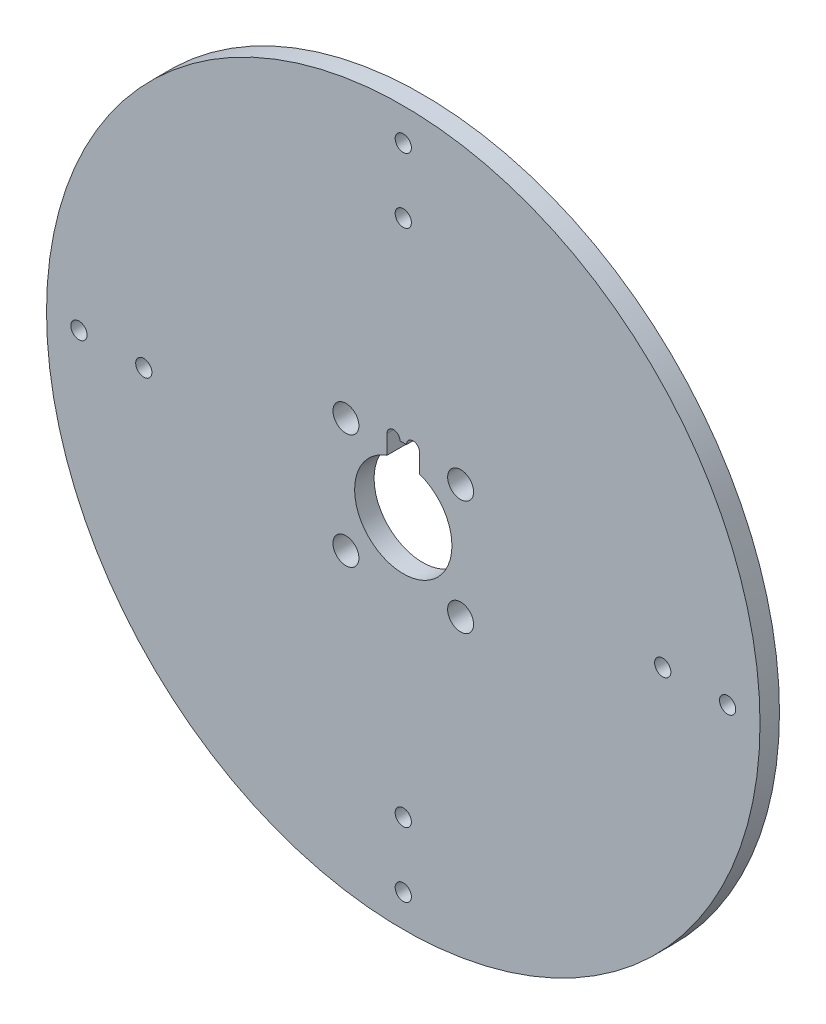
ISO-10303-21;
HEADER;
FILE_DESCRIPTION(('STEP AP214'),'2;1');
FILE_NAME('part.step','',(''),(''),'','','');
FILE_SCHEMA(('AUTOMOTIVE_DESIGN { 1 0 10303 214 1 1 1 1 }'));
ENDSEC;
DATA;
#1=APPLICATION_CONTEXT('core data for automotive mechanical design processes');
#2=APPLICATION_PROTOCOL_DEFINITION('international standard','automotive_design',2000,#1);
#3=PRODUCT_CONTEXT('',#1,'mechanical');
#4=PRODUCT('Part','Part','',(#3));
#5=PRODUCT_RELATED_PRODUCT_CATEGORY('part','',(#4));
#6=PRODUCT_DEFINITION_FORMATION('','',#4);
#7=PRODUCT_DEFINITION_CONTEXT('part definition',#1,'design');
#8=PRODUCT_DEFINITION('design','',#6,#7);
#9=PRODUCT_DEFINITION_SHAPE('','',#8);
#10=(LENGTH_UNIT() NAMED_UNIT(*) SI_UNIT(.MILLI.,.METRE.));
#11=(NAMED_UNIT(*) PLANE_ANGLE_UNIT() SI_UNIT($,.RADIAN.));
#12=(NAMED_UNIT(*) SI_UNIT($,.STERADIAN.) SOLID_ANGLE_UNIT());
#13=UNCERTAINTY_MEASURE_WITH_UNIT(LENGTH_MEASURE(1.E-05),#10,'distance_accuracy_value','');
#14=(GEOMETRIC_REPRESENTATION_CONTEXT(3) GLOBAL_UNCERTAINTY_ASSIGNED_CONTEXT((#13)) GLOBAL_UNIT_ASSIGNED_CONTEXT((#10,
#11,#12)) REPRESENTATION_CONTEXT('',''));
#15=CARTESIAN_POINT('',(0.,0.,0.));
#16=DIRECTION('',(0.,0.,1.));
#17=DIRECTION('',(1.,0.,0.));
#18=AXIS2_PLACEMENT_3D('',#15,#16,#17);
#19=CARTESIAN_POINT('',(0.,0.,1.5));
#20=DIRECTION('',(0.,0.,1.));
#21=DIRECTION('',(1.,0.,0.));
#22=AXIS2_PLACEMENT_3D('',#19,#20,#21);
#23=PLANE('',#22);
#24=CARTESIAN_POINT('',(-8.83883476483186,-8.83883476483183,1.5));
#25=DIRECTION('',(0.,0.,1.));
#26=DIRECTION('',(1.,0.,0.));
#27=AXIS2_PLACEMENT_3D('',#24,#25,#26);
#28=CIRCLE('',#27,1.99999999999999);
#29=CARTESIAN_POINT('',(-6.83883476483187,-8.83883476483183,1.5));
#30=VERTEX_POINT('',#29);
#31=EDGE_CURVE('E218',#30,#30,#28,.T.);
#32=ORIENTED_EDGE('',*,*,#31,.F.);
#33=EDGE_LOOP('',(#32));
#34=FACE_BOUND('',#33,.T.);
#35=CARTESIAN_POINT('',(-8.83883476483183,8.83883476483186,1.5));
#36=DIRECTION('',(0.,0.,1.));
#37=DIRECTION('',(1.,0.,0.));
#38=AXIS2_PLACEMENT_3D('',#35,#36,#37);
#39=CIRCLE('',#38,1.99999999999999);
#40=CARTESIAN_POINT('',(-6.83883476483184,8.83883476483186,1.5));
#41=VERTEX_POINT('',#40);
#42=EDGE_CURVE('E212',#41,#41,#39,.T.);
#43=ORIENTED_EDGE('',*,*,#42,.F.);
#44=EDGE_LOOP('',(#43));
#45=FACE_BOUND('',#44,.T.);
#46=CARTESIAN_POINT('',(8.83883476483186,8.83883476483183,1.5));
#47=DIRECTION('',(0.,0.,1.));
#48=DIRECTION('',(1.,0.,0.));
#49=AXIS2_PLACEMENT_3D('',#46,#47,#48);
#50=CIRCLE('',#49,1.99999999999999);
#51=CARTESIAN_POINT('',(10.8388347648318,8.83883476483183,1.5));
#52=VERTEX_POINT('',#51);
#53=EDGE_CURVE('E209',#52,#52,#50,.T.);
#54=ORIENTED_EDGE('',*,*,#53,.F.);
#55=EDGE_LOOP('',(#54));
#56=FACE_BOUND('',#55,.T.);
#57=CARTESIAN_POINT('',(8.83883476483183,-8.83883476483186,1.5));
#58=DIRECTION('',(0.,0.,1.));
#59=DIRECTION('',(1.,0.,0.));
#60=AXIS2_PLACEMENT_3D('',#57,#58,#59);
#61=CIRCLE('',#60,1.99999999999999);
#62=CARTESIAN_POINT('',(10.8388347648318,-8.83883476483186,1.5));
#63=VERTEX_POINT('',#62);
#64=EDGE_CURVE('E203',#63,#63,#61,.T.);
#65=ORIENTED_EDGE('',*,*,#64,.F.);
#66=EDGE_LOOP('',(#65));
#67=FACE_BOUND('',#66,.T.);
#68=CARTESIAN_POINT('',(0.,50.,1.5));
#69=DIRECTION('',(0.,0.,1.));
#70=DIRECTION('',(1.,0.,0.));
#71=AXIS2_PLACEMENT_3D('',#68,#69,#70);
#72=CIRCLE('',#71,1.25);
#73=CARTESIAN_POINT('',(1.25,50.,1.5));
#74=VERTEX_POINT('',#73);
#75=EDGE_CURVE('E197',#74,#74,#72,.T.);
#76=ORIENTED_EDGE('',*,*,#75,.F.);
#77=EDGE_LOOP('',(#76));
#78=FACE_BOUND('',#77,.T.);
#79=CARTESIAN_POINT('',(0.,40.,1.5));
#80=DIRECTION('',(0.,0.,1.));
#81=DIRECTION('',(1.,0.,0.));
#82=AXIS2_PLACEMENT_3D('',#79,#80,#81);
#83=CIRCLE('',#82,1.25);
#84=CARTESIAN_POINT('',(1.25,40.,1.5));
#85=VERTEX_POINT('',#84);
#86=EDGE_CURVE('E191',#85,#85,#83,.T.);
#87=ORIENTED_EDGE('',*,*,#86,.F.);
#88=EDGE_LOOP('',(#87));
#89=FACE_BOUND('',#88,.T.);
#90=CARTESIAN_POINT('',(-50.,0.,1.5));
#91=DIRECTION('',(0.,0.,1.));
#92=DIRECTION('',(1.,0.,0.));
#93=AXIS2_PLACEMENT_3D('',#90,#91,#92);
#94=CIRCLE('',#93,1.25);
#95=CARTESIAN_POINT('',(-48.75,0.,1.5));
#96=VERTEX_POINT('',#95);
#97=EDGE_CURVE('E185',#96,#96,#94,.T.);
#98=ORIENTED_EDGE('',*,*,#97,.F.);
#99=EDGE_LOOP('',(#98));
#100=FACE_BOUND('',#99,.T.);
#101=CARTESIAN_POINT('',(-40.,0.,1.5));
#102=DIRECTION('',(0.,0.,1.));
#103=DIRECTION('',(1.,0.,0.));
#104=AXIS2_PLACEMENT_3D('',#101,#102,#103);
#105=CIRCLE('',#104,1.25);
#106=CARTESIAN_POINT('',(-38.75,0.,1.5));
#107=VERTEX_POINT('',#106);
#108=EDGE_CURVE('E179',#107,#107,#105,.T.);
#109=ORIENTED_EDGE('',*,*,#108,.F.);
#110=EDGE_LOOP('',(#109));
#111=FACE_BOUND('',#110,.T.);
#112=CARTESIAN_POINT('',(0.,-50.,1.5));
#113=DIRECTION('',(0.,0.,1.));
#114=DIRECTION('',(1.,0.,0.));
#115=AXIS2_PLACEMENT_3D('',#112,#113,#114);
#116=CIRCLE('',#115,1.25);
#117=CARTESIAN_POINT('',(1.25000000000001,-50.,1.5));
#118=VERTEX_POINT('',#117);
#119=EDGE_CURVE('E173',#118,#118,#116,.T.);
#120=ORIENTED_EDGE('',*,*,#119,.F.);
#121=EDGE_LOOP('',(#120));
#122=FACE_BOUND('',#121,.T.);
#123=CARTESIAN_POINT('',(0.,-40.,1.5));
#124=DIRECTION('',(0.,0.,1.));
#125=DIRECTION('',(1.,0.,0.));
#126=AXIS2_PLACEMENT_3D('',#123,#124,#125);
#127=CIRCLE('',#126,1.25);
#128=CARTESIAN_POINT('',(1.25,-40.,1.5));
#129=VERTEX_POINT('',#128);
#130=EDGE_CURVE('E167',#129,#129,#127,.T.);
#131=ORIENTED_EDGE('',*,*,#130,.F.);
#132=EDGE_LOOP('',(#131));
#133=FACE_BOUND('',#132,.T.);
#134=CARTESIAN_POINT('',(50.,0.,1.5));
#135=DIRECTION('',(0.,0.,1.));
#136=DIRECTION('',(1.,0.,0.));
#137=AXIS2_PLACEMENT_3D('',#134,#135,#136);
#138=CIRCLE('',#137,1.25);
#139=CARTESIAN_POINT('',(51.25,0.,1.5));
#140=VERTEX_POINT('',#139);
#141=EDGE_CURVE('E161',#140,#140,#138,.T.);
#142=ORIENTED_EDGE('',*,*,#141,.F.);
#143=EDGE_LOOP('',(#142));
#144=FACE_BOUND('',#143,.T.);
#145=CARTESIAN_POINT('',(40.,0.,1.5));
#146=DIRECTION('',(0.,0.,1.));
#147=DIRECTION('',(1.,0.,0.));
#148=AXIS2_PLACEMENT_3D('',#145,#146,#147);
#149=CIRCLE('',#148,1.25);
#150=CARTESIAN_POINT('',(41.25,0.,1.5));
#151=VERTEX_POINT('',#150);
#152=EDGE_CURVE('E153',#151,#151,#149,.T.);
#153=ORIENTED_EDGE('',*,*,#152,.F.);
#154=EDGE_LOOP('',(#153));
#155=FACE_BOUND('',#154,.T.);
#156=CARTESIAN_POINT('',(0.,0.,1.5));
#157=DIRECTION('',(0.,0.,1.));
#158=DIRECTION('',(1.,0.,0.));
#159=AXIS2_PLACEMENT_3D('',#156,#157,#158);
#160=CIRCLE('',#159,55.);
#161=CARTESIAN_POINT('',(55.,0.,1.5));
#162=VERTEX_POINT('',#161);
#163=EDGE_CURVE('E11',#162,#162,#160,.T.);
#164=ORIENTED_EDGE('',*,*,#163,.T.);
#165=EDGE_LOOP('',(#164));
#166=FACE_BOUND('',#165,.T.);
#167=DIRECTION('',(0.,1.,0.));
#168=VECTOR('',#167,1.);
#169=CARTESIAN_POINT('',(-2.5,0.,1.5));
#170=LINE('',#169,#168);
#171=CARTESIAN_POINT('',(-2.5,7.07106781186548,1.5));
#172=VERTEX_POINT('',#171);
#173=CARTESIAN_POINT('',(-2.5,10.,1.5));
#174=VERTEX_POINT('',#173);
#175=EDGE_CURVE('E99',#172,#174,#170,.T.);
#176=ORIENTED_EDGE('',*,*,#175,.T.);
#177=CARTESIAN_POINT('',(-1.5,10.,1.5));
#178=DIRECTION('',(0.,0.,1.));
#179=DIRECTION('',(1.,0.,0.));
#180=AXIS2_PLACEMENT_3D('',#177,#178,#179);
#181=CIRCLE('',#180,1.);
#182=CARTESIAN_POINT('',(-0.499999999999999,10.,1.5));
#183=VERTEX_POINT('',#182);
#184=EDGE_CURVE('E49',#174,#183,#181,.F.);
#185=ORIENTED_EDGE('',*,*,#184,.T.);
#186=DIRECTION('',(1.,0.,0.));
#187=VECTOR('',#186,1.);
#188=CARTESIAN_POINT('',(0.,10.,1.5));
#189=LINE('',#188,#187);
#190=CARTESIAN_POINT('',(0.499999999999999,10.,1.5));
#191=VERTEX_POINT('',#190);
#192=EDGE_CURVE('E112',#183,#191,#189,.T.);
#193=ORIENTED_EDGE('',*,*,#192,.T.);
#194=CARTESIAN_POINT('',(1.5,10.,1.5));
#195=DIRECTION('',(0.,0.,1.));
#196=DIRECTION('',(1.,0.,0.));
#197=AXIS2_PLACEMENT_3D('',#194,#195,#196);
#198=CIRCLE('',#197,1.);
#199=CARTESIAN_POINT('',(2.5,10.,1.5));
#200=VERTEX_POINT('',#199);
#201=EDGE_CURVE('E107',#191,#200,#198,.F.);
#202=ORIENTED_EDGE('',*,*,#201,.T.);
#203=DIRECTION('',(0.,-1.,0.));
#204=VECTOR('',#203,1.);
#205=CARTESIAN_POINT('',(2.5,0.,1.5));
#206=LINE('',#205,#204);
#207=CARTESIAN_POINT('',(2.5,7.07106781186548,1.5));
#208=VERTEX_POINT('',#207);
#209=EDGE_CURVE('E105',#200,#208,#206,.T.);
#210=ORIENTED_EDGE('',*,*,#209,.T.);
#211=CARTESIAN_POINT('',(0.,0.,1.5));
#212=DIRECTION('',(0.,0.,1.));
#213=DIRECTION('',(1.,0.,0.));
#214=AXIS2_PLACEMENT_3D('',#211,#212,#213);
#215=CIRCLE('',#214,7.5);
#216=EDGE_CURVE('E91',#172,#208,#215,.T.);
#217=ORIENTED_EDGE('',*,*,#216,.F.);
#218=EDGE_LOOP('',(#176,#185,#193,#202,#210,#217));
#219=FACE_BOUND('',#218,.T.);
#220=ADVANCED_FACE('F32',(#34,#45,#56,#67,#78,#89,#100,#111,#122,#133,#144,#155,#166,#219),#23,.T.);
#221=CARTESIAN_POINT('',(0.,0.,-1.5));
#222=DIRECTION('',(0.,0.,1.));
#223=DIRECTION('',(1.,0.,0.));
#224=AXIS2_PLACEMENT_3D('',#221,#222,#223);
#225=PLANE('',#224);
#226=CARTESIAN_POINT('',(-8.83883476483186,-8.83883476483183,-1.5));
#227=DIRECTION('',(0.,0.,1.));
#228=DIRECTION('',(1.,0.,0.));
#229=AXIS2_PLACEMENT_3D('',#226,#227,#228);
#230=CIRCLE('',#229,1.99999999999999);
#231=CARTESIAN_POINT('',(-6.83883476483187,-8.83883476483183,-1.5));
#232=VERTEX_POINT('',#231);
#233=EDGE_CURVE('E215',#232,#232,#230,.T.);
#234=ORIENTED_EDGE('',*,*,#233,.T.);
#235=EDGE_LOOP('',(#234));
#236=FACE_BOUND('',#235,.T.);
#237=CARTESIAN_POINT('',(-8.83883476483183,8.83883476483186,-1.5));
#238=DIRECTION('',(0.,0.,1.));
#239=DIRECTION('',(1.,0.,0.));
#240=AXIS2_PLACEMENT_3D('',#237,#238,#239);
#241=CIRCLE('',#240,1.99999999999999);
#242=CARTESIAN_POINT('',(-6.83883476483184,8.83883476483186,-1.5));
#243=VERTEX_POINT('',#242);
#244=EDGE_CURVE('E36',#243,#243,#241,.T.);
#245=ORIENTED_EDGE('',*,*,#244,.T.);
#246=EDGE_LOOP('',(#245));
#247=FACE_BOUND('',#246,.T.);
#248=CARTESIAN_POINT('',(8.83883476483186,8.83883476483183,-1.5));
#249=DIRECTION('',(0.,0.,1.));
#250=DIRECTION('',(1.,0.,0.));
#251=AXIS2_PLACEMENT_3D('',#248,#249,#250);
#252=CIRCLE('',#251,1.99999999999999);
#253=CARTESIAN_POINT('',(10.8388347648318,8.83883476483183,-1.5));
#254=VERTEX_POINT('',#253);
#255=EDGE_CURVE('E206',#254,#254,#252,.T.);
#256=ORIENTED_EDGE('',*,*,#255,.T.);
#257=EDGE_LOOP('',(#256));
#258=FACE_BOUND('',#257,.T.);
#259=CARTESIAN_POINT('',(8.83883476483183,-8.83883476483186,-1.5));
#260=DIRECTION('',(0.,0.,1.));
#261=DIRECTION('',(1.,0.,0.));
#262=AXIS2_PLACEMENT_3D('',#259,#260,#261);
#263=CIRCLE('',#262,1.99999999999999);
#264=CARTESIAN_POINT('',(10.8388347648318,-8.83883476483186,-1.5));
#265=VERTEX_POINT('',#264);
#266=EDGE_CURVE('E200',#265,#265,#263,.T.);
#267=ORIENTED_EDGE('',*,*,#266,.T.);
#268=EDGE_LOOP('',(#267));
#269=FACE_BOUND('',#268,.T.);
#270=CARTESIAN_POINT('',(0.,50.,-1.5));
#271=DIRECTION('',(0.,0.,1.));
#272=DIRECTION('',(1.,0.,0.));
#273=AXIS2_PLACEMENT_3D('',#270,#271,#272);
#274=CIRCLE('',#273,1.25);
#275=CARTESIAN_POINT('',(1.25,50.,-1.5));
#276=VERTEX_POINT('',#275);
#277=EDGE_CURVE('E194',#276,#276,#274,.T.);
#278=ORIENTED_EDGE('',*,*,#277,.T.);
#279=EDGE_LOOP('',(#278));
#280=FACE_BOUND('',#279,.T.);
#281=CARTESIAN_POINT('',(0.,40.,-1.5));
#282=DIRECTION('',(0.,0.,1.));
#283=DIRECTION('',(1.,0.,0.));
#284=AXIS2_PLACEMENT_3D('',#281,#282,#283);
#285=CIRCLE('',#284,1.25);
#286=CARTESIAN_POINT('',(1.25,40.,-1.5));
#287=VERTEX_POINT('',#286);
#288=EDGE_CURVE('E188',#287,#287,#285,.T.);
#289=ORIENTED_EDGE('',*,*,#288,.T.);
#290=EDGE_LOOP('',(#289));
#291=FACE_BOUND('',#290,.T.);
#292=CARTESIAN_POINT('',(-50.,0.,-1.5));
#293=DIRECTION('',(0.,0.,1.));
#294=DIRECTION('',(1.,0.,0.));
#295=AXIS2_PLACEMENT_3D('',#292,#293,#294);
#296=CIRCLE('',#295,1.25);
#297=CARTESIAN_POINT('',(-48.75,0.,-1.5));
#298=VERTEX_POINT('',#297);
#299=EDGE_CURVE('E182',#298,#298,#296,.T.);
#300=ORIENTED_EDGE('',*,*,#299,.T.);
#301=EDGE_LOOP('',(#300));
#302=FACE_BOUND('',#301,.T.);
#303=CARTESIAN_POINT('',(-40.,0.,-1.5));
#304=DIRECTION('',(0.,0.,1.));
#305=DIRECTION('',(1.,0.,0.));
#306=AXIS2_PLACEMENT_3D('',#303,#304,#305);
#307=CIRCLE('',#306,1.25);
#308=CARTESIAN_POINT('',(-38.75,0.,-1.5));
#309=VERTEX_POINT('',#308);
#310=EDGE_CURVE('E176',#309,#309,#307,.T.);
#311=ORIENTED_EDGE('',*,*,#310,.T.);
#312=EDGE_LOOP('',(#311));
#313=FACE_BOUND('',#312,.T.);
#314=CARTESIAN_POINT('',(0.,-50.,-1.5));
#315=DIRECTION('',(0.,0.,1.));
#316=DIRECTION('',(1.,0.,0.));
#317=AXIS2_PLACEMENT_3D('',#314,#315,#316);
#318=CIRCLE('',#317,1.25);
#319=CARTESIAN_POINT('',(1.25000000000001,-50.,-1.5));
#320=VERTEX_POINT('',#319);
#321=EDGE_CURVE('E170',#320,#320,#318,.T.);
#322=ORIENTED_EDGE('',*,*,#321,.T.);
#323=EDGE_LOOP('',(#322));
#324=FACE_BOUND('',#323,.T.);
#325=CARTESIAN_POINT('',(0.,-40.,-1.5));
#326=DIRECTION('',(0.,0.,1.));
#327=DIRECTION('',(1.,0.,0.));
#328=AXIS2_PLACEMENT_3D('',#325,#326,#327);
#329=CIRCLE('',#328,1.25);
#330=CARTESIAN_POINT('',(1.25,-40.,-1.5));
#331=VERTEX_POINT('',#330);
#332=EDGE_CURVE('E164',#331,#331,#329,.T.);
#333=ORIENTED_EDGE('',*,*,#332,.T.);
#334=EDGE_LOOP('',(#333));
#335=FACE_BOUND('',#334,.T.);
#336=CARTESIAN_POINT('',(50.,0.,-1.5));
#337=DIRECTION('',(0.,0.,1.));
#338=DIRECTION('',(1.,0.,0.));
#339=AXIS2_PLACEMENT_3D('',#336,#337,#338);
#340=CIRCLE('',#339,1.25);
#341=CARTESIAN_POINT('',(51.25,0.,-1.5));
#342=VERTEX_POINT('',#341);
#343=EDGE_CURVE('E158',#342,#342,#340,.T.);
#344=ORIENTED_EDGE('',*,*,#343,.T.);
#345=EDGE_LOOP('',(#344));
#346=FACE_BOUND('',#345,.T.);
#347=CARTESIAN_POINT('',(40.,0.,-1.5));
#348=DIRECTION('',(0.,0.,1.));
#349=DIRECTION('',(1.,0.,0.));
#350=AXIS2_PLACEMENT_3D('',#347,#348,#349);
#351=CIRCLE('',#350,1.25);
#352=CARTESIAN_POINT('',(41.25,0.,-1.5));
#353=VERTEX_POINT('',#352);
#354=EDGE_CURVE('E151',#353,#353,#351,.T.);
#355=ORIENTED_EDGE('',*,*,#354,.T.);
#356=EDGE_LOOP('',(#355));
#357=FACE_BOUND('',#356,.T.);
#358=CARTESIAN_POINT('',(0.,0.,-1.5));
#359=DIRECTION('',(0.,0.,1.));
#360=DIRECTION('',(1.,0.,0.));
#361=AXIS2_PLACEMENT_3D('',#358,#359,#360);
#362=CIRCLE('',#361,55.);
#363=CARTESIAN_POINT('',(55.,0.,-1.5));
#364=VERTEX_POINT('',#363);
#365=EDGE_CURVE('E41',#364,#364,#362,.T.);
#366=ORIENTED_EDGE('',*,*,#365,.F.);
#367=EDGE_LOOP('',(#366));
#368=FACE_BOUND('',#367,.T.);
#369=CARTESIAN_POINT('',(-1.5,10.,-1.5));
#370=DIRECTION('',(0.,0.,1.));
#371=DIRECTION('',(1.,0.,0.));
#372=AXIS2_PLACEMENT_3D('',#369,#370,#371);
#373=CIRCLE('',#372,1.);
#374=CARTESIAN_POINT('',(-2.5,10.,-1.5));
#375=VERTEX_POINT('',#374);
#376=CARTESIAN_POINT('',(-0.499999999999999,10.,-1.5));
#377=VERTEX_POINT('',#376);
#378=EDGE_CURVE('E115',#375,#377,#373,.F.);
#379=ORIENTED_EDGE('',*,*,#378,.F.);
#380=DIRECTION('',(0.,1.,0.));
#381=VECTOR('',#380,1.);
#382=CARTESIAN_POINT('',(-2.5,0.,-1.5));
#383=LINE('',#382,#381);
#384=CARTESIAN_POINT('',(-2.5,7.07106781186548,-1.5));
#385=VERTEX_POINT('',#384);
#386=EDGE_CURVE('E117',#385,#375,#383,.T.);
#387=ORIENTED_EDGE('',*,*,#386,.F.);
#388=CARTESIAN_POINT('',(0.,0.,-1.5));
#389=DIRECTION('',(0.,0.,1.));
#390=DIRECTION('',(1.,0.,0.));
#391=AXIS2_PLACEMENT_3D('',#388,#389,#390);
#392=CIRCLE('',#391,7.5);
#393=CARTESIAN_POINT('',(2.5,7.07106781186548,-1.5));
#394=VERTEX_POINT('',#393);
#395=EDGE_CURVE('E57',#385,#394,#392,.T.);
#396=ORIENTED_EDGE('',*,*,#395,.T.);
#397=DIRECTION('',(0.,-1.,0.));
#398=VECTOR('',#397,1.);
#399=CARTESIAN_POINT('',(2.5,0.,-1.5));
#400=LINE('',#399,#398);
#401=CARTESIAN_POINT('',(2.5,10.,-1.5));
#402=VERTEX_POINT('',#401);
#403=EDGE_CURVE('E120',#402,#394,#400,.T.);
#404=ORIENTED_EDGE('',*,*,#403,.F.);
#405=CARTESIAN_POINT('',(1.5,10.,-1.5));
#406=DIRECTION('',(0.,0.,1.));
#407=DIRECTION('',(1.,0.,0.));
#408=AXIS2_PLACEMENT_3D('',#405,#406,#407);
#409=CIRCLE('',#408,1.);
#410=CARTESIAN_POINT('',(0.499999999999999,10.,-1.5));
#411=VERTEX_POINT('',#410);
#412=EDGE_CURVE('E122',#411,#402,#409,.F.);
#413=ORIENTED_EDGE('',*,*,#412,.F.);
#414=DIRECTION('',(1.,0.,0.));
#415=VECTOR('',#414,1.);
#416=CARTESIAN_POINT('',(0.,10.,-1.5));
#417=LINE('',#416,#415);
#418=EDGE_CURVE('E124',#377,#411,#417,.T.);
#419=ORIENTED_EDGE('',*,*,#418,.F.);
#420=EDGE_LOOP('',(#379,#387,#396,#404,#413,#419));
#421=FACE_BOUND('',#420,.T.);
#422=ADVANCED_FACE('F137',(#236,#247,#258,#269,#280,#291,#302,#313,#324,#335,#346,#357,#368,
#421),#225,.F.);
#423=CARTESIAN_POINT('',(0.,0.,1.5));
#424=DIRECTION('',(0.,0.,-1.));
#425=DIRECTION('',(-1.,0.,0.));
#426=AXIS2_PLACEMENT_3D('',#423,#424,#425);
#427=CYLINDRICAL_SURFACE('',#426,55.);
#428=ORIENTED_EDGE('',*,*,#163,.F.);
#429=EDGE_LOOP('',(#428));
#430=FACE_BOUND('',#429,.T.);
#431=ORIENTED_EDGE('',*,*,#365,.T.);
#432=EDGE_LOOP('',(#431));
#433=FACE_BOUND('',#432,.T.);
#434=ADVANCED_FACE('F34',(#430,#433),#427,.T.);
#435=CARTESIAN_POINT('',(-1.5,10.,-1.5));
#436=DIRECTION('',(0.,0.,1.));
#437=DIRECTION('',(1.,0.,0.));
#438=AXIS2_PLACEMENT_3D('',#435,#436,#437);
#439=CYLINDRICAL_SURFACE('',#438,1.);
#440=DIRECTION('',(0.,0.,1.));
#441=VECTOR('',#440,1.);
#442=CARTESIAN_POINT('',(-2.5,10.,-1.5));
#443=LINE('',#442,#441);
#444=EDGE_CURVE('E96',#375,#174,#443,.T.);
#445=ORIENTED_EDGE('',*,*,#444,.F.);
#446=ORIENTED_EDGE('',*,*,#378,.T.);
#447=DIRECTION('',(0.,0.,1.));
#448=VECTOR('',#447,1.);
#449=CARTESIAN_POINT('',(-0.499999999999999,10.,-1.5));
#450=LINE('',#449,#448);
#451=EDGE_CURVE('E126',#377,#183,#450,.T.);
#452=ORIENTED_EDGE('',*,*,#451,.T.);
#453=ORIENTED_EDGE('',*,*,#184,.F.);
#454=EDGE_LOOP('',(#445,#446,#452,#453));
#455=FACE_BOUND('',#454,.T.);
#456=ADVANCED_FACE('F145',(#455),#439,.F.);
#457=CARTESIAN_POINT('',(0.,10.,-1.5));
#458=DIRECTION('',(0.,-1.,0.));
#459=DIRECTION('',(0.,0.,-1.));
#460=AXIS2_PLACEMENT_3D('',#457,#458,#459);
#461=PLANE('',#460);
#462=ORIENTED_EDGE('',*,*,#451,.F.);
#463=ORIENTED_EDGE('',*,*,#418,.T.);
#464=DIRECTION('',(0.,0.,1.));
#465=VECTOR('',#464,1.);
#466=CARTESIAN_POINT('',(0.499999999999999,10.,-1.5));
#467=LINE('',#466,#465);
#468=EDGE_CURVE('E128',#411,#191,#467,.T.);
#469=ORIENTED_EDGE('',*,*,#468,.T.);
#470=ORIENTED_EDGE('',*,*,#192,.F.);
#471=EDGE_LOOP('',(#462,#463,#469,#470));
#472=FACE_BOUND('',#471,.T.);
#473=ADVANCED_FACE('F148',(#472),#461,.T.);
#474=CARTESIAN_POINT('',(1.5,10.,-1.5));
#475=DIRECTION('',(0.,0.,1.));
#476=DIRECTION('',(1.,0.,0.));
#477=AXIS2_PLACEMENT_3D('',#474,#475,#476);
#478=CYLINDRICAL_SURFACE('',#477,1.);
#479=ORIENTED_EDGE('',*,*,#468,.F.);
#480=ORIENTED_EDGE('',*,*,#412,.T.);
#481=DIRECTION('',(0.,0.,1.));
#482=VECTOR('',#481,1.);
#483=CARTESIAN_POINT('',(2.5,10.,-1.5));
#484=LINE('',#483,#482);
#485=EDGE_CURVE('E130',#402,#200,#484,.T.);
#486=ORIENTED_EDGE('',*,*,#485,.T.);
#487=ORIENTED_EDGE('',*,*,#201,.F.);
#488=EDGE_LOOP('',(#479,#480,#486,#487));
#489=FACE_BOUND('',#488,.T.);
#490=ADVANCED_FACE('F260',(#489),#478,.F.);
#491=CARTESIAN_POINT('',(2.5,0.,-1.5));
#492=DIRECTION('',(-1.,0.,0.));
#493=DIRECTION('',(0.,0.,1.));
#494=AXIS2_PLACEMENT_3D('',#491,#492,#493);
#495=PLANE('',#494);
#496=ORIENTED_EDGE('',*,*,#485,.F.);
#497=ORIENTED_EDGE('',*,*,#403,.T.);
#498=DIRECTION('',(0.,0.,1.));
#499=VECTOR('',#498,1.);
#500=CARTESIAN_POINT('',(2.5,7.07106781186548,-1.5));
#501=LINE('',#500,#499);
#502=EDGE_CURVE('E95',#394,#208,#501,.T.);
#503=ORIENTED_EDGE('',*,*,#502,.T.);
#504=ORIENTED_EDGE('',*,*,#209,.F.);
#505=EDGE_LOOP('',(#496,#497,#503,#504));
#506=FACE_BOUND('',#505,.T.);
#507=ADVANCED_FACE('F268',(#506),#495,.T.);
#508=CARTESIAN_POINT('',(0.,0.,-1.5));
#509=DIRECTION('',(0.,0.,1.));
#510=DIRECTION('',(1.,0.,0.));
#511=AXIS2_PLACEMENT_3D('',#508,#509,#510);
#512=CYLINDRICAL_SURFACE('',#511,7.5);
#513=ORIENTED_EDGE('',*,*,#502,.F.);
#514=ORIENTED_EDGE('',*,*,#395,.F.);
#515=DIRECTION('',(0.,0.,1.));
#516=VECTOR('',#515,1.);
#517=CARTESIAN_POINT('',(-2.5,7.07106781186548,-1.5));
#518=LINE('',#517,#516);
#519=EDGE_CURVE('E87',#385,#172,#518,.T.);
#520=ORIENTED_EDGE('',*,*,#519,.T.);
#521=ORIENTED_EDGE('',*,*,#216,.T.);
#522=EDGE_LOOP('',(#513,#514,#520,#521));
#523=FACE_BOUND('',#522,.T.);
#524=ADVANCED_FACE('F89',(#523),#512,.F.);
#525=CARTESIAN_POINT('',(-2.5,0.,-1.5));
#526=DIRECTION('',(1.,0.,0.));
#527=DIRECTION('',(0.,0.,-1.));
#528=AXIS2_PLACEMENT_3D('',#525,#526,#527);
#529=PLANE('',#528);
#530=ORIENTED_EDGE('',*,*,#519,.F.);
#531=ORIENTED_EDGE('',*,*,#386,.T.);
#532=ORIENTED_EDGE('',*,*,#444,.T.);
#533=ORIENTED_EDGE('',*,*,#175,.F.);
#534=EDGE_LOOP('',(#530,#531,#532,#533));
#535=FACE_BOUND('',#534,.T.);
#536=ADVANCED_FACE('F100',(#535),#529,.T.);
#537=CARTESIAN_POINT('',(40.,0.,1.5));
#538=DIRECTION('',(0.,0.,1.));
#539=DIRECTION('',(1.,0.,0.));
#540=AXIS2_PLACEMENT_3D('',#537,#538,#539);
#541=CYLINDRICAL_SURFACE('',#540,1.25);
#542=ORIENTED_EDGE('',*,*,#354,.F.);
#543=EDGE_LOOP('',(#542));
#544=FACE_BOUND('',#543,.T.);
#545=ORIENTED_EDGE('',*,*,#152,.T.);
#546=EDGE_LOOP('',(#545));
#547=FACE_BOUND('',#546,.T.);
#548=ADVANCED_FACE('F265',(#544,#547),#541,.F.);
#549=CARTESIAN_POINT('',(50.,0.,1.5));
#550=DIRECTION('',(0.,0.,1.));
#551=DIRECTION('',(1.,0.,0.));
#552=AXIS2_PLACEMENT_3D('',#549,#550,#551);
#553=CYLINDRICAL_SURFACE('',#552,1.25);
#554=ORIENTED_EDGE('',*,*,#343,.F.);
#555=EDGE_LOOP('',(#554));
#556=FACE_BOUND('',#555,.T.);
#557=ORIENTED_EDGE('',*,*,#141,.T.);
#558=EDGE_LOOP('',(#557));
#559=FACE_BOUND('',#558,.T.);
#560=ADVANCED_FACE('F277',(#556,#559),#553,.F.);
#561=CARTESIAN_POINT('',(0.,-40.,1.5));
#562=DIRECTION('',(0.,0.,1.));
#563=DIRECTION('',(1.,0.,0.));
#564=AXIS2_PLACEMENT_3D('',#561,#562,#563);
#565=CYLINDRICAL_SURFACE('',#564,1.25);
#566=ORIENTED_EDGE('',*,*,#332,.F.);
#567=EDGE_LOOP('',(#566));
#568=FACE_BOUND('',#567,.T.);
#569=ORIENTED_EDGE('',*,*,#130,.T.);
#570=EDGE_LOOP('',(#569));
#571=FACE_BOUND('',#570,.T.);
#572=ADVANCED_FACE('F281',(#568,#571),#565,.F.);
#573=CARTESIAN_POINT('',(0.,-50.,1.5));
#574=DIRECTION('',(0.,0.,1.));
#575=DIRECTION('',(1.,0.,0.));
#576=AXIS2_PLACEMENT_3D('',#573,#574,#575);
#577=CYLINDRICAL_SURFACE('',#576,1.25);
#578=ORIENTED_EDGE('',*,*,#321,.F.);
#579=EDGE_LOOP('',(#578));
#580=FACE_BOUND('',#579,.T.);
#581=ORIENTED_EDGE('',*,*,#119,.T.);
#582=EDGE_LOOP('',(#581));
#583=FACE_BOUND('',#582,.T.);
#584=ADVANCED_FACE('F285',(#580,#583),#577,.F.);
#585=CARTESIAN_POINT('',(-40.,0.,1.5));
#586=DIRECTION('',(0.,0.,1.));
#587=DIRECTION('',(1.,0.,0.));
#588=AXIS2_PLACEMENT_3D('',#585,#586,#587);
#589=CYLINDRICAL_SURFACE('',#588,1.25);
#590=ORIENTED_EDGE('',*,*,#310,.F.);
#591=EDGE_LOOP('',(#590));
#592=FACE_BOUND('',#591,.T.);
#593=ORIENTED_EDGE('',*,*,#108,.T.);
#594=EDGE_LOOP('',(#593));
#595=FACE_BOUND('',#594,.T.);
#596=ADVANCED_FACE('F289',(#592,#595),#589,.F.);
#597=CARTESIAN_POINT('',(-50.,0.,1.5));
#598=DIRECTION('',(0.,0.,1.));
#599=DIRECTION('',(1.,0.,0.));
#600=AXIS2_PLACEMENT_3D('',#597,#598,#599);
#601=CYLINDRICAL_SURFACE('',#600,1.25);
#602=ORIENTED_EDGE('',*,*,#299,.F.);
#603=EDGE_LOOP('',(#602));
#604=FACE_BOUND('',#603,.T.);
#605=ORIENTED_EDGE('',*,*,#97,.T.);
#606=EDGE_LOOP('',(#605));
#607=FACE_BOUND('',#606,.T.);
#608=ADVANCED_FACE('F293',(#604,#607),#601,.F.);
#609=CARTESIAN_POINT('',(0.,40.,1.5));
#610=DIRECTION('',(0.,0.,1.));
#611=DIRECTION('',(1.,0.,0.));
#612=AXIS2_PLACEMENT_3D('',#609,#610,#611);
#613=CYLINDRICAL_SURFACE('',#612,1.25);
#614=ORIENTED_EDGE('',*,*,#288,.F.);
#615=EDGE_LOOP('',(#614));
#616=FACE_BOUND('',#615,.T.);
#617=ORIENTED_EDGE('',*,*,#86,.T.);
#618=EDGE_LOOP('',(#617));
#619=FACE_BOUND('',#618,.T.);
#620=ADVANCED_FACE('F297',(#616,#619),#613,.F.);
#621=CARTESIAN_POINT('',(0.,50.,1.5));
#622=DIRECTION('',(0.,0.,1.));
#623=DIRECTION('',(1.,0.,0.));
#624=AXIS2_PLACEMENT_3D('',#621,#622,#623);
#625=CYLINDRICAL_SURFACE('',#624,1.25);
#626=ORIENTED_EDGE('',*,*,#277,.F.);
#627=EDGE_LOOP('',(#626));
#628=FACE_BOUND('',#627,.T.);
#629=ORIENTED_EDGE('',*,*,#75,.T.);
#630=EDGE_LOOP('',(#629));
#631=FACE_BOUND('',#630,.T.);
#632=ADVANCED_FACE('F301',(#628,#631),#625,.F.);
#633=CARTESIAN_POINT('',(8.83883476483183,-8.83883476483186,1.5));
#634=DIRECTION('',(0.,0.,1.));
#635=DIRECTION('',(1.,0.,0.));
#636=AXIS2_PLACEMENT_3D('',#633,#634,#635);
#637=CYLINDRICAL_SURFACE('',#636,1.99999999999999);
#638=ORIENTED_EDGE('',*,*,#64,.T.);
#639=EDGE_LOOP('',(#638));
#640=FACE_BOUND('',#639,.T.);
#641=ORIENTED_EDGE('',*,*,#266,.F.);
#642=EDGE_LOOP('',(#641));
#643=FACE_BOUND('',#642,.T.);
#644=ADVANCED_FACE('F305',(#640,#643),#637,.F.);
#645=CARTESIAN_POINT('',(8.83883476483186,8.83883476483183,1.5));
#646=DIRECTION('',(0.,0.,1.));
#647=DIRECTION('',(1.,0.,0.));
#648=AXIS2_PLACEMENT_3D('',#645,#646,#647);
#649=CYLINDRICAL_SURFACE('',#648,1.99999999999999);
#650=ORIENTED_EDGE('',*,*,#53,.T.);
#651=EDGE_LOOP('',(#650));
#652=FACE_BOUND('',#651,.T.);
#653=ORIENTED_EDGE('',*,*,#255,.F.);
#654=EDGE_LOOP('',(#653));
#655=FACE_BOUND('',#654,.T.);
#656=ADVANCED_FACE('F309',(#652,#655),#649,.F.);
#657=CARTESIAN_POINT('',(-8.83883476483183,8.83883476483186,1.5));
#658=DIRECTION('',(0.,0.,1.));
#659=DIRECTION('',(1.,0.,0.));
#660=AXIS2_PLACEMENT_3D('',#657,#658,#659);
#661=CYLINDRICAL_SURFACE('',#660,1.99999999999999);
#662=ORIENTED_EDGE('',*,*,#42,.T.);
#663=EDGE_LOOP('',(#662));
#664=FACE_BOUND('',#663,.T.);
#665=ORIENTED_EDGE('',*,*,#244,.F.);
#666=EDGE_LOOP('',(#665));
#667=FACE_BOUND('',#666,.T.);
#668=ADVANCED_FACE('F313',(#664,#667),#661,.F.);
#669=CARTESIAN_POINT('',(-8.83883476483186,-8.83883476483183,1.5));
#670=DIRECTION('',(0.,0.,1.));
#671=DIRECTION('',(1.,0.,0.));
#672=AXIS2_PLACEMENT_3D('',#669,#670,#671);
#673=CYLINDRICAL_SURFACE('',#672,1.99999999999999);
#674=ORIENTED_EDGE('',*,*,#31,.T.);
#675=EDGE_LOOP('',(#674));
#676=FACE_BOUND('',#675,.T.);
#677=ORIENTED_EDGE('',*,*,#233,.F.);
#678=EDGE_LOOP('',(#677));
#679=FACE_BOUND('',#678,.T.);
#680=ADVANCED_FACE('F222',(#676,#679),#673,.F.);
#681=CLOSED_SHELL('',(#220,#422,#434,#456,#473,#490,#507,#524,#536,#548,#560,#572,#584,#596,
#608,#620,#632,#644,#656,#668,#680));
#682=MANIFOLD_SOLID_BREP('B2',#681);
#683=ADVANCED_BREP_SHAPE_REPRESENTATION('',(#18,#682),#14);
#684=SHAPE_DEFINITION_REPRESENTATION(#9,#683);
ENDSEC;
END-ISO-10303-21;
